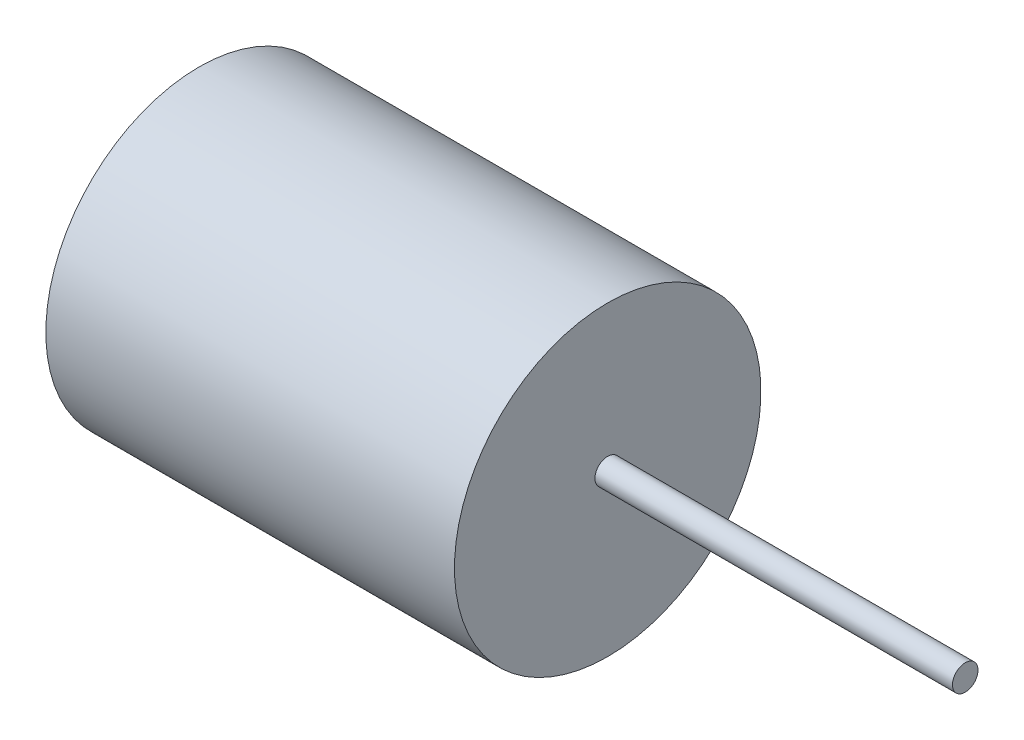
ISO-10303-21;
HEADER;
FILE_DESCRIPTION(('STEP AP214'),'2;1');
FILE_NAME('part.step','',(''),(''),'','','');
FILE_SCHEMA(('AUTOMOTIVE_DESIGN { 1 0 10303 214 1 1 1 1 }'));
ENDSEC;
DATA;
#1=APPLICATION_CONTEXT('core data for automotive mechanical design processes');
#2=APPLICATION_PROTOCOL_DEFINITION('international standard','automotive_design',2000,#1);
#3=PRODUCT_CONTEXT('',#1,'mechanical');
#4=PRODUCT('Part','Part','',(#3));
#5=PRODUCT_RELATED_PRODUCT_CATEGORY('part','',(#4));
#6=PRODUCT_DEFINITION_FORMATION('','',#4);
#7=PRODUCT_DEFINITION_CONTEXT('part definition',#1,'design');
#8=PRODUCT_DEFINITION('design','',#6,#7);
#9=PRODUCT_DEFINITION_SHAPE('','',#8);
#10=(LENGTH_UNIT() NAMED_UNIT(*) SI_UNIT(.MILLI.,.METRE.));
#11=(NAMED_UNIT(*) PLANE_ANGLE_UNIT() SI_UNIT($,.RADIAN.));
#12=(NAMED_UNIT(*) SI_UNIT($,.STERADIAN.) SOLID_ANGLE_UNIT());
#13=UNCERTAINTY_MEASURE_WITH_UNIT(LENGTH_MEASURE(1.E-05),#10,'distance_accuracy_value','');
#14=(GEOMETRIC_REPRESENTATION_CONTEXT(3) GLOBAL_UNCERTAINTY_ASSIGNED_CONTEXT((#13)) GLOBAL_UNIT_ASSIGNED_CONTEXT((#10,
#11,#12)) REPRESENTATION_CONTEXT('',''));
#15=CARTESIAN_POINT('',(0.,0.,0.));
#16=DIRECTION('',(0.,0.,1.));
#17=DIRECTION('',(1.,0.,0.));
#18=AXIS2_PLACEMENT_3D('',#15,#16,#17);
#19=CARTESIAN_POINT('',(-48.5161713286713,-1.47727272727273,0.));
#20=DIRECTION('',(-1.,0.,0.));
#21=DIRECTION('',(0.,-1.,0.));
#22=AXIS2_PLACEMENT_3D('',#19,#20,#21);
#23=PLANE('',#22);
#24=CARTESIAN_POINT('',(-48.5161713286713,-1.47727272727273,0.));
#25=DIRECTION('',(1.,0.,0.));
#26=DIRECTION('',(0.,1.,0.));
#27=AXIS2_PLACEMENT_3D('',#24,#25,#26);
#28=CIRCLE('',#27,30.);
#29=CARTESIAN_POINT('',(-48.5161713286713,28.5227272727273,0.));
#30=VERTEX_POINT('',#29);
#31=EDGE_CURVE('E10',#30,#30,#28,.T.);
#32=ORIENTED_EDGE('',*,*,#31,.F.);
#33=EDGE_LOOP('',(#32));
#34=FACE_BOUND('',#33,.T.);
#35=ADVANCED_FACE('F37',(#34),#23,.T.);
#36=CARTESIAN_POINT('',(31.4838286713287,-1.47727272727272,0.));
#37=DIRECTION('',(1.,0.,0.));
#38=DIRECTION('',(0.,1.,0.));
#39=AXIS2_PLACEMENT_3D('',#36,#37,#38);
#40=CYLINDRICAL_SURFACE('',#39,30.);
#41=ORIENTED_EDGE('',*,*,#31,.T.);
#42=EDGE_LOOP('',(#41));
#43=FACE_BOUND('',#42,.T.);
#44=CARTESIAN_POINT('',(31.4838286713287,-1.47727272727272,0.));
#45=DIRECTION('',(1.,0.,0.));
#46=DIRECTION('',(0.,1.,0.));
#47=AXIS2_PLACEMENT_3D('',#44,#45,#46);
#48=CIRCLE('',#47,30.);
#49=CARTESIAN_POINT('',(31.4838286713287,28.5227272727273,0.));
#50=VERTEX_POINT('',#49);
#51=EDGE_CURVE('E44',#50,#50,#48,.T.);
#52=ORIENTED_EDGE('',*,*,#51,.F.);
#53=EDGE_LOOP('',(#52));
#54=FACE_BOUND('',#53,.T.);
#55=ADVANCED_FACE('F65',(#43,#54),#40,.T.);
#56=CARTESIAN_POINT('',(31.4838286713287,28.5227272727273,0.));
#57=DIRECTION('',(1.,0.,0.));
#58=DIRECTION('',(0.,1.,0.));
#59=AXIS2_PLACEMENT_3D('',#56,#57,#58);
#60=PLANE('',#59);
#61=CARTESIAN_POINT('',(31.4838286713287,0.,0.));
#62=DIRECTION('',(1.,0.,0.));
#63=DIRECTION('',(0.,1.,0.));
#64=AXIS2_PLACEMENT_3D('',#61,#62,#63);
#65=CIRCLE('',#64,2.5);
#66=CARTESIAN_POINT('',(31.4838286713287,2.5,0.));
#67=VERTEX_POINT('',#66);
#68=EDGE_CURVE('E54',#67,#67,#65,.T.);
#69=ORIENTED_EDGE('',*,*,#68,.F.);
#70=EDGE_LOOP('',(#69));
#71=FACE_BOUND('',#70,.T.);
#72=ORIENTED_EDGE('',*,*,#51,.T.);
#73=EDGE_LOOP('',(#72));
#74=FACE_BOUND('',#73,.T.);
#75=ADVANCED_FACE('F63',(#71,#74),#60,.T.);
#76=CARTESIAN_POINT('',(101.483828671329,0.,0.));
#77=DIRECTION('',(-1.,0.,0.));
#78=DIRECTION('',(0.,-1.,0.));
#79=AXIS2_PLACEMENT_3D('',#76,#77,#78);
#80=CYLINDRICAL_SURFACE('',#79,2.5);
#81=CARTESIAN_POINT('',(101.483828671329,0.,0.));
#82=DIRECTION('',(1.,0.,0.));
#83=DIRECTION('',(0.,1.,0.));
#84=AXIS2_PLACEMENT_3D('',#81,#82,#83);
#85=CIRCLE('',#84,2.5);
#86=CARTESIAN_POINT('',(101.483828671329,2.50000000000001,0.));
#87=VERTEX_POINT('',#86);
#88=EDGE_CURVE('E49',#87,#87,#85,.T.);
#89=ORIENTED_EDGE('',*,*,#88,.F.);
#90=EDGE_LOOP('',(#89));
#91=FACE_BOUND('',#90,.T.);
#92=ORIENTED_EDGE('',*,*,#68,.T.);
#93=EDGE_LOOP('',(#92));
#94=FACE_BOUND('',#93,.T.);
#95=ADVANCED_FACE('F61',(#91,#94),#80,.T.);
#96=CARTESIAN_POINT('',(101.483828671329,0.,0.));
#97=DIRECTION('',(1.,0.,0.));
#98=DIRECTION('',(0.,1.,0.));
#99=AXIS2_PLACEMENT_3D('',#96,#97,#98);
#100=PLANE('',#99);
#101=ORIENTED_EDGE('',*,*,#88,.T.);
#102=EDGE_LOOP('',(#101));
#103=FACE_BOUND('',#102,.T.);
#104=ADVANCED_FACE('F71',(#103),#100,.T.);
#105=CLOSED_SHELL('',(#35,#55,#75,#95,#104));
#106=MANIFOLD_SOLID_BREP('B2',#105);
#107=ADVANCED_BREP_SHAPE_REPRESENTATION('',(#18,#106),#14);
#108=SHAPE_DEFINITION_REPRESENTATION(#9,#107);
ENDSEC;
END-ISO-10303-21;
